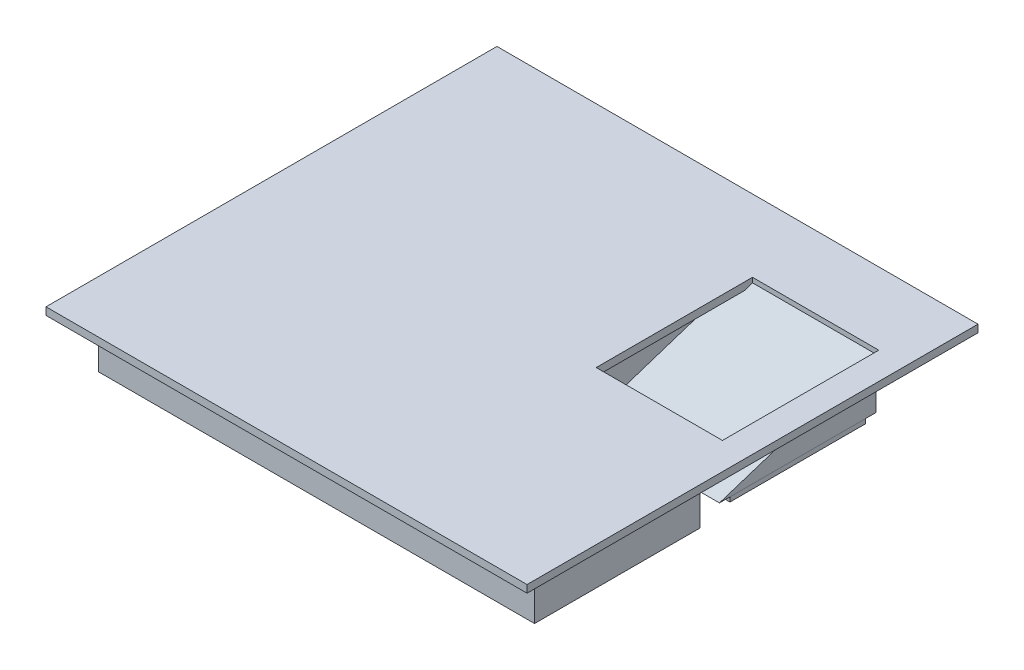
ISO-10303-21;
HEADER;
FILE_DESCRIPTION(('STEP AP214'),'2;1');
FILE_NAME('part.step','',(''),(''),'','','');
FILE_SCHEMA(('AUTOMOTIVE_DESIGN { 1 0 10303 214 1 1 1 1 }'));
ENDSEC;
DATA;
#1=APPLICATION_CONTEXT('core data for automotive mechanical design processes');
#2=APPLICATION_PROTOCOL_DEFINITION('international standard','automotive_design',2000,#1);
#3=PRODUCT_CONTEXT('',#1,'mechanical');
#4=PRODUCT('Part','Part','',(#3));
#5=PRODUCT_RELATED_PRODUCT_CATEGORY('part','',(#4));
#6=PRODUCT_DEFINITION_FORMATION('','',#4);
#7=PRODUCT_DEFINITION_CONTEXT('part definition',#1,'design');
#8=PRODUCT_DEFINITION('design','',#6,#7);
#9=PRODUCT_DEFINITION_SHAPE('','',#8);
#10=(LENGTH_UNIT() NAMED_UNIT(*) SI_UNIT(.MILLI.,.METRE.));
#11=(NAMED_UNIT(*) PLANE_ANGLE_UNIT() SI_UNIT($,.RADIAN.));
#12=(NAMED_UNIT(*) SI_UNIT($,.STERADIAN.) SOLID_ANGLE_UNIT());
#13=UNCERTAINTY_MEASURE_WITH_UNIT(LENGTH_MEASURE(1.E-05),#10,'distance_accuracy_value','');
#14=(GEOMETRIC_REPRESENTATION_CONTEXT(3) GLOBAL_UNCERTAINTY_ASSIGNED_CONTEXT((#13)) GLOBAL_UNIT_ASSIGNED_CONTEXT((#10,
#11,#12)) REPRESENTATION_CONTEXT('',''));
#15=CARTESIAN_POINT('',(0.,0.,0.));
#16=DIRECTION('',(0.,0.,1.));
#17=DIRECTION('',(1.,0.,0.));
#18=AXIS2_PLACEMENT_3D('',#15,#16,#17);
#19=CARTESIAN_POINT('',(0.,5.,0.));
#20=DIRECTION('',(1.,0.,0.));
#21=DIRECTION('',(0.,0.,-1.));
#22=AXIS2_PLACEMENT_3D('',#19,#20,#21);
#23=PLANE('',#22);
#24=DIRECTION('',(0.,0.,1.));
#25=VECTOR('',#24,1.);
#26=CARTESIAN_POINT('',(0.,0.,0.));
#27=LINE('',#26,#25);
#28=CARTESIAN_POINT('',(0.,0.,-300.));
#29=VERTEX_POINT('',#28);
#30=CARTESIAN_POINT('',(0.,0.,0.));
#31=VERTEX_POINT('',#30);
#32=EDGE_CURVE('E254',#29,#31,#27,.T.);
#33=ORIENTED_EDGE('',*,*,#32,.T.);
#34=DIRECTION('',(0.,-1.,0.));
#35=VECTOR('',#34,1.);
#36=CARTESIAN_POINT('',(0.,5.,0.));
#37=LINE('',#36,#35);
#38=CARTESIAN_POINT('',(0.,5.,0.));
#39=VERTEX_POINT('',#38);
#40=EDGE_CURVE('E325',#39,#31,#37,.T.);
#41=ORIENTED_EDGE('',*,*,#40,.F.);
#42=DIRECTION('',(0.,0.,1.));
#43=VECTOR('',#42,1.);
#44=CARTESIAN_POINT('',(0.,5.,0.));
#45=LINE('',#44,#43);
#46=CARTESIAN_POINT('',(0.,5.,-300.));
#47=VERTEX_POINT('',#46);
#48=EDGE_CURVE('E337',#47,#39,#45,.T.);
#49=ORIENTED_EDGE('',*,*,#48,.F.);
#50=DIRECTION('',(0.,-1.,0.));
#51=VECTOR('',#50,1.);
#52=CARTESIAN_POINT('',(0.,5.,-300.));
#53=LINE('',#52,#51);
#54=EDGE_CURVE('E338',#47,#29,#53,.T.);
#55=ORIENTED_EDGE('',*,*,#54,.T.);
#56=EDGE_LOOP('',(#33,#41,#49,#55));
#57=FACE_BOUND('',#56,.T.);
#58=ADVANCED_FACE('F47',(#57),#23,.F.);
#59=CARTESIAN_POINT('',(0.,5.,0.));
#60=DIRECTION('',(0.,0.,-1.));
#61=DIRECTION('',(-1.,0.,0.));
#62=AXIS2_PLACEMENT_3D('',#59,#60,#61);
#63=PLANE('',#62);
#64=DIRECTION('',(1.,0.,0.));
#65=VECTOR('',#64,1.);
#66=CARTESIAN_POINT('',(0.,0.,0.));
#67=LINE('',#66,#65);
#68=CARTESIAN_POINT('',(320.,0.,0.));
#69=VERTEX_POINT('',#68);
#70=EDGE_CURVE('E329',#31,#69,#67,.T.);
#71=ORIENTED_EDGE('',*,*,#70,.T.);
#72=DIRECTION('',(0.,-1.,0.));
#73=VECTOR('',#72,1.);
#74=CARTESIAN_POINT('',(320.,5.,0.));
#75=LINE('',#74,#73);
#76=CARTESIAN_POINT('',(320.,5.,0.));
#77=VERTEX_POINT('',#76);
#78=EDGE_CURVE('E330',#77,#69,#75,.T.);
#79=ORIENTED_EDGE('',*,*,#78,.F.);
#80=DIRECTION('',(1.,0.,0.));
#81=VECTOR('',#80,1.);
#82=CARTESIAN_POINT('',(0.,5.,0.));
#83=LINE('',#82,#81);
#84=EDGE_CURVE('E350',#39,#77,#83,.T.);
#85=ORIENTED_EDGE('',*,*,#84,.F.);
#86=ORIENTED_EDGE('',*,*,#40,.T.);
#87=EDGE_LOOP('',(#71,#79,#85,#86));
#88=FACE_BOUND('',#87,.T.);
#89=ADVANCED_FACE('F450',(#88),#63,.F.);
#90=CARTESIAN_POINT('',(320.,5.,0.));
#91=DIRECTION('',(-1.,0.,0.));
#92=DIRECTION('',(0.,0.,1.));
#93=AXIS2_PLACEMENT_3D('',#90,#91,#92);
#94=PLANE('',#93);
#95=DIRECTION('',(0.,0.,-1.));
#96=VECTOR('',#95,1.);
#97=CARTESIAN_POINT('',(320.,0.,0.));
#98=LINE('',#97,#96);
#99=CARTESIAN_POINT('',(320.,0.,-300.));
#100=VERTEX_POINT('',#99);
#101=EDGE_CURVE('E328',#69,#100,#98,.T.);
#102=ORIENTED_EDGE('',*,*,#101,.T.);
#103=DIRECTION('',(0.,-1.,0.));
#104=VECTOR('',#103,1.);
#105=CARTESIAN_POINT('',(320.,5.,-300.));
#106=LINE('',#105,#104);
#107=CARTESIAN_POINT('',(320.,5.,-300.));
#108=VERTEX_POINT('',#107);
#109=EDGE_CURVE('E334',#108,#100,#106,.T.);
#110=ORIENTED_EDGE('',*,*,#109,.F.);
#111=DIRECTION('',(0.,0.,-1.));
#112=VECTOR('',#111,1.);
#113=CARTESIAN_POINT('',(320.,5.,0.));
#114=LINE('',#113,#112);
#115=EDGE_CURVE('E348',#77,#108,#114,.T.);
#116=ORIENTED_EDGE('',*,*,#115,.F.);
#117=ORIENTED_EDGE('',*,*,#78,.T.);
#118=EDGE_LOOP('',(#102,#110,#116,#117));
#119=FACE_BOUND('',#118,.T.);
#120=ADVANCED_FACE('F456',(#119),#94,.F.);
#121=CARTESIAN_POINT('',(0.,5.,-300.));
#122=DIRECTION('',(0.,0.,1.));
#123=DIRECTION('',(1.,0.,0.));
#124=AXIS2_PLACEMENT_3D('',#121,#122,#123);
#125=PLANE('',#124);
#126=DIRECTION('',(-1.,0.,0.));
#127=VECTOR('',#126,1.);
#128=CARTESIAN_POINT('',(0.,0.,-300.));
#129=LINE('',#128,#127);
#130=EDGE_CURVE('E333',#100,#29,#129,.T.);
#131=ORIENTED_EDGE('',*,*,#130,.T.);
#132=ORIENTED_EDGE('',*,*,#54,.F.);
#133=DIRECTION('',(-1.,0.,0.));
#134=VECTOR('',#133,1.);
#135=CARTESIAN_POINT('',(0.,5.,-300.));
#136=LINE('',#135,#134);
#137=EDGE_CURVE('E346',#108,#47,#136,.T.);
#138=ORIENTED_EDGE('',*,*,#137,.F.);
#139=ORIENTED_EDGE('',*,*,#109,.T.);
#140=EDGE_LOOP('',(#131,#132,#138,#139));
#141=FACE_BOUND('',#140,.T.);
#142=ADVANCED_FACE('F464',(#141),#125,.F.);
#143=CARTESIAN_POINT('',(0.,5.,0.));
#144=DIRECTION('',(0.,-1.,0.));
#145=DIRECTION('',(0.,0.,-1.));
#146=AXIS2_PLACEMENT_3D('',#143,#144,#145);
#147=PLANE('',#146);
#148=DIRECTION('',(1.,0.,0.));
#149=VECTOR('',#148,1.);
#150=CARTESIAN_POINT('',(218.,5.,-148.));
#151=LINE('',#150,#149);
#152=CARTESIAN_POINT('',(218.,5.,-148.));
#153=VERTEX_POINT('',#152);
#154=CARTESIAN_POINT('',(302.,5.,-148.));
#155=VERTEX_POINT('',#154);
#156=EDGE_CURVE('E197',#153,#155,#151,.T.);
#157=ORIENTED_EDGE('',*,*,#156,.F.);
#158=DIRECTION('',(0.,0.,1.));
#159=VECTOR('',#158,1.);
#160=CARTESIAN_POINT('',(218.,5.,-252.));
#161=LINE('',#160,#159);
#162=CARTESIAN_POINT('',(218.,5.,-252.));
#163=VERTEX_POINT('',#162);
#164=EDGE_CURVE('E215',#163,#153,#161,.T.);
#165=ORIENTED_EDGE('',*,*,#164,.F.);
#166=DIRECTION('',(-1.,0.,0.));
#167=VECTOR('',#166,1.);
#168=CARTESIAN_POINT('',(218.,5.,-252.));
#169=LINE('',#168,#167);
#170=CARTESIAN_POINT('',(302.,5.,-252.));
#171=VERTEX_POINT('',#170);
#172=EDGE_CURVE('E208',#171,#163,#169,.T.);
#173=ORIENTED_EDGE('',*,*,#172,.F.);
#174=DIRECTION('',(0.,0.,-1.));
#175=VECTOR('',#174,1.);
#176=CARTESIAN_POINT('',(302.,5.,-252.));
#177=LINE('',#176,#175);
#178=EDGE_CURVE('E189',#155,#171,#177,.T.);
#179=ORIENTED_EDGE('',*,*,#178,.F.);
#180=EDGE_LOOP('',(#157,#165,#173,#179));
#181=FACE_BOUND('',#180,.T.);
#182=ORIENTED_EDGE('',*,*,#48,.T.);
#183=ORIENTED_EDGE('',*,*,#84,.T.);
#184=ORIENTED_EDGE('',*,*,#115,.T.);
#185=ORIENTED_EDGE('',*,*,#137,.T.);
#186=EDGE_LOOP('',(#182,#183,#184,#185));
#187=FACE_BOUND('',#186,.T.);
#188=ADVANCED_FACE('F205',(#181,#187),#147,.F.);
#189=CARTESIAN_POINT('',(0.,0.,0.));
#190=DIRECTION('',(0.,-1.,0.));
#191=DIRECTION('',(0.,0.,-1.));
#192=AXIS2_PLACEMENT_3D('',#189,#190,#191);
#193=PLANE('',#192);
#194=DIRECTION('',(-1.,0.,0.));
#195=VECTOR('',#194,1.);
#196=CARTESIAN_POINT('',(0.,0.,-246.485873189608));
#197=LINE('',#196,#195);
#198=CARTESIAN_POINT('',(218.,0.,-246.485873189608));
#199=VERTEX_POINT('',#198);
#200=CARTESIAN_POINT('',(210.,0.,-246.485873189608));
#201=VERTEX_POINT('',#200);
#202=EDGE_CURVE('E251',#199,#201,#197,.T.);
#203=ORIENTED_EDGE('',*,*,#202,.F.);
#204=DIRECTION('',(0.,0.,-1.));
#205=VECTOR('',#204,1.);
#206=CARTESIAN_POINT('',(218.,0.,0.));
#207=LINE('',#206,#205);
#208=CARTESIAN_POINT('',(218.,0.,-148.));
#209=VERTEX_POINT('',#208);
#210=EDGE_CURVE('E250',#209,#199,#207,.T.);
#211=ORIENTED_EDGE('',*,*,#210,.F.);
#212=DIRECTION('',(-1.,0.,0.));
#213=VECTOR('',#212,1.);
#214=CARTESIAN_POINT('',(0.,0.,-148.));
#215=LINE('',#214,#213);
#216=CARTESIAN_POINT('',(302.,0.,-148.));
#217=VERTEX_POINT('',#216);
#218=EDGE_CURVE('E209',#217,#209,#215,.T.);
#219=ORIENTED_EDGE('',*,*,#218,.F.);
#220=DIRECTION('',(0.,0.,1.));
#221=VECTOR('',#220,1.);
#222=CARTESIAN_POINT('',(302.,0.,0.));
#223=LINE('',#222,#221);
#224=CARTESIAN_POINT('',(302.,0.,-252.));
#225=VERTEX_POINT('',#224);
#226=EDGE_CURVE('E192',#225,#217,#223,.T.);
#227=ORIENTED_EDGE('',*,*,#226,.F.);
#228=DIRECTION('',(1.,0.,0.));
#229=VECTOR('',#228,1.);
#230=CARTESIAN_POINT('',(1.66533453693774E-13,0.,-252.));
#231=LINE('',#230,#229);
#232=CARTESIAN_POINT('',(300.,0.,-252.));
#233=VERTEX_POINT('',#232);
#234=EDGE_CURVE('E218',#233,#225,#231,.T.);
#235=ORIENTED_EDGE('',*,*,#234,.F.);
#236=CARTESIAN_POINT('',(210.,0.,-252.));
#237=VERTEX_POINT('',#236);
#238=EDGE_CURVE('E262',#237,#233,#231,.T.);
#239=ORIENTED_EDGE('',*,*,#238,.F.);
#240=DIRECTION('',(0.,0.,1.));
#241=VECTOR('',#240,1.);
#242=CARTESIAN_POINT('',(210.,0.,0.));
#243=LINE('',#242,#241);
#244=EDGE_CURVE('E12',#237,#201,#243,.T.);
#245=ORIENTED_EDGE('',*,*,#244,.T.);
#246=EDGE_LOOP('',(#203,#211,#219,#227,#235,#239,#245));
#247=FACE_BOUND('',#246,.T.);
#248=DIRECTION('',(0.,0.,-1.));
#249=VECTOR('',#248,1.);
#250=CARTESIAN_POINT('',(15.,0.,0.));
#251=LINE('',#250,#249);
#252=CARTESIAN_POINT('',(15.,0.,-20.));
#253=VERTEX_POINT('',#252);
#254=CARTESIAN_POINT('',(15.,0.,-130.));
#255=VERTEX_POINT('',#254);
#256=EDGE_CURVE('E266',#253,#255,#251,.T.);
#257=ORIENTED_EDGE('',*,*,#256,.F.);
#258=DIRECTION('',(-1.,0.,0.));
#259=VECTOR('',#258,1.);
#260=CARTESIAN_POINT('',(0.,0.,-20.));
#261=LINE('',#260,#259);
#262=CARTESIAN_POINT('',(305.,0.,-20.));
#263=VERTEX_POINT('',#262);
#264=EDGE_CURVE('E281',#263,#253,#261,.T.);
#265=ORIENTED_EDGE('',*,*,#264,.F.);
#266=DIRECTION('',(0.,0.,1.));
#267=VECTOR('',#266,1.);
#268=CARTESIAN_POINT('',(305.,0.,0.));
#269=LINE('',#268,#267);
#270=CARTESIAN_POINT('',(305.,0.,-130.));
#271=VERTEX_POINT('',#270);
#272=EDGE_CURVE('E276',#271,#263,#269,.T.);
#273=ORIENTED_EDGE('',*,*,#272,.F.);
#274=DIRECTION('',(1.,0.,0.));
#275=VECTOR('',#274,1.);
#276=CARTESIAN_POINT('',(0.,0.,-130.));
#277=LINE('',#276,#275);
#278=EDGE_CURVE('E271',#255,#271,#277,.T.);
#279=ORIENTED_EDGE('',*,*,#278,.F.);
#280=EDGE_LOOP('',(#257,#265,#273,#279));
#281=FACE_BOUND('',#280,.T.);
#282=DIRECTION('',(0.,0.,-1.));
#283=VECTOR('',#282,1.);
#284=CARTESIAN_POINT('',(120.,0.,0.));
#285=LINE('',#284,#283);
#286=CARTESIAN_POINT('',(120.,0.,-155.));
#287=VERTEX_POINT('',#286);
#288=CARTESIAN_POINT('',(120.,0.,-245.));
#289=VERTEX_POINT('',#288);
#290=EDGE_CURVE('E285',#287,#289,#285,.T.);
#291=ORIENTED_EDGE('',*,*,#290,.F.);
#292=DIRECTION('',(-1.,0.,0.));
#293=VECTOR('',#292,1.);
#294=CARTESIAN_POINT('',(0.,0.,-155.));
#295=LINE('',#294,#293);
#296=CARTESIAN_POINT('',(200.,0.,-155.));
#297=VERTEX_POINT('',#296);
#298=EDGE_CURVE('E300',#297,#287,#295,.T.);
#299=ORIENTED_EDGE('',*,*,#298,.F.);
#300=DIRECTION('',(0.,0.,1.));
#301=VECTOR('',#300,1.);
#302=CARTESIAN_POINT('',(200.,0.,0.));
#303=LINE('',#302,#301);
#304=CARTESIAN_POINT('',(200.,0.,-245.));
#305=VERTEX_POINT('',#304);
#306=EDGE_CURVE('E295',#305,#297,#303,.T.);
#307=ORIENTED_EDGE('',*,*,#306,.F.);
#308=DIRECTION('',(1.,0.,0.));
#309=VECTOR('',#308,1.);
#310=CARTESIAN_POINT('',(0.,0.,-245.));
#311=LINE('',#310,#309);
#312=EDGE_CURVE('E290',#289,#305,#311,.T.);
#313=ORIENTED_EDGE('',*,*,#312,.F.);
#314=EDGE_LOOP('',(#291,#299,#307,#313));
#315=FACE_BOUND('',#314,.T.);
#316=DIRECTION('',(0.,0.,-1.));
#317=VECTOR('',#316,1.);
#318=CARTESIAN_POINT('',(20.,0.,0.));
#319=LINE('',#318,#317);
#320=CARTESIAN_POINT('',(20.,0.,-155.));
#321=VERTEX_POINT('',#320);
#322=CARTESIAN_POINT('',(20.,0.,-245.));
#323=VERTEX_POINT('',#322);
#324=EDGE_CURVE('E305',#321,#323,#319,.T.);
#325=ORIENTED_EDGE('',*,*,#324,.F.);
#326=DIRECTION('',(-1.,0.,0.));
#327=VECTOR('',#326,1.);
#328=CARTESIAN_POINT('',(0.,0.,-155.));
#329=LINE('',#328,#327);
#330=CARTESIAN_POINT('',(100.,0.,-155.));
#331=VERTEX_POINT('',#330);
#332=EDGE_CURVE('E320',#331,#321,#329,.T.);
#333=ORIENTED_EDGE('',*,*,#332,.F.);
#334=DIRECTION('',(0.,0.,1.));
#335=VECTOR('',#334,1.);
#336=CARTESIAN_POINT('',(100.,0.,0.));
#337=LINE('',#336,#335);
#338=CARTESIAN_POINT('',(100.,0.,-245.));
#339=VERTEX_POINT('',#338);
#340=EDGE_CURVE('E315',#339,#331,#337,.T.);
#341=ORIENTED_EDGE('',*,*,#340,.F.);
#342=DIRECTION('',(1.,0.,0.));
#343=VECTOR('',#342,1.);
#344=CARTESIAN_POINT('',(0.,0.,-245.));
#345=LINE('',#344,#343);
#346=EDGE_CURVE('E310',#323,#339,#345,.T.);
#347=ORIENTED_EDGE('',*,*,#346,.F.);
#348=EDGE_LOOP('',(#325,#333,#341,#347));
#349=FACE_BOUND('',#348,.T.);
#350=ORIENTED_EDGE('',*,*,#32,.F.);
#351=ORIENTED_EDGE('',*,*,#130,.F.);
#352=ORIENTED_EDGE('',*,*,#101,.F.);
#353=ORIENTED_EDGE('',*,*,#70,.F.);
#354=EDGE_LOOP('',(#350,#351,#352,#353));
#355=FACE_BOUND('',#354,.T.);
#356=ADVANCED_FACE('F404',(#247,#281,#315,#349,#355),#193,.T.);
#357=CARTESIAN_POINT('',(20.,-35.,-245.));
#358=DIRECTION('',(-1.,0.,0.));
#359=DIRECTION('',(0.,0.,1.));
#360=AXIS2_PLACEMENT_3D('',#357,#358,#359);
#361=PLANE('',#360);
#362=DIRECTION('',(0.,1.,0.));
#363=VECTOR('',#362,1.);
#364=CARTESIAN_POINT('',(20.,-35.,-155.));
#365=LINE('',#364,#363);
#366=CARTESIAN_POINT('',(20.,-35.,-155.));
#367=VERTEX_POINT('',#366);
#368=EDGE_CURVE('E309',#367,#321,#365,.T.);
#369=ORIENTED_EDGE('',*,*,#368,.T.);
#370=ORIENTED_EDGE('',*,*,#324,.T.);
#371=DIRECTION('',(0.,1.,0.));
#372=VECTOR('',#371,1.);
#373=CARTESIAN_POINT('',(20.,-35.,-245.));
#374=LINE('',#373,#372);
#375=CARTESIAN_POINT('',(20.,-35.,-245.));
#376=VERTEX_POINT('',#375);
#377=EDGE_CURVE('E314',#376,#323,#374,.T.);
#378=ORIENTED_EDGE('',*,*,#377,.F.);
#379=DIRECTION('',(0.,0.,1.));
#380=VECTOR('',#379,1.);
#381=CARTESIAN_POINT('',(20.,-35.,-245.));
#382=LINE('',#381,#380);
#383=EDGE_CURVE('E308',#376,#367,#382,.T.);
#384=ORIENTED_EDGE('',*,*,#383,.T.);
#385=EDGE_LOOP('',(#369,#370,#378,#384));
#386=FACE_BOUND('',#385,.T.);
#387=ADVANCED_FACE('F471',(#386),#361,.T.);
#388=CARTESIAN_POINT('',(20.,-35.,-245.));
#389=DIRECTION('',(0.,0.,-1.));
#390=DIRECTION('',(-1.,0.,0.));
#391=AXIS2_PLACEMENT_3D('',#388,#389,#390);
#392=PLANE('',#391);
#393=ORIENTED_EDGE('',*,*,#377,.T.);
#394=ORIENTED_EDGE('',*,*,#346,.T.);
#395=DIRECTION('',(0.,1.,0.));
#396=VECTOR('',#395,1.);
#397=CARTESIAN_POINT('',(100.,-35.,-245.));
#398=LINE('',#397,#396);
#399=CARTESIAN_POINT('',(100.,-35.,-245.));
#400=VERTEX_POINT('',#399);
#401=EDGE_CURVE('E319',#400,#339,#398,.T.);
#402=ORIENTED_EDGE('',*,*,#401,.F.);
#403=DIRECTION('',(-1.,0.,0.));
#404=VECTOR('',#403,1.);
#405=CARTESIAN_POINT('',(20.,-35.,-245.));
#406=LINE('',#405,#404);
#407=EDGE_CURVE('E313',#400,#376,#406,.T.);
#408=ORIENTED_EDGE('',*,*,#407,.T.);
#409=EDGE_LOOP('',(#393,#394,#402,#408));
#410=FACE_BOUND('',#409,.T.);
#411=ADVANCED_FACE('F476',(#410),#392,.T.);
#412=CARTESIAN_POINT('',(100.,-35.,-245.));
#413=DIRECTION('',(1.,0.,0.));
#414=DIRECTION('',(0.,0.,-1.));
#415=AXIS2_PLACEMENT_3D('',#412,#413,#414);
#416=PLANE('',#415);
#417=ORIENTED_EDGE('',*,*,#401,.T.);
#418=ORIENTED_EDGE('',*,*,#340,.T.);
#419=DIRECTION('',(0.,1.,0.));
#420=VECTOR('',#419,1.);
#421=CARTESIAN_POINT('',(100.,-35.,-155.));
#422=LINE('',#421,#420);
#423=CARTESIAN_POINT('',(100.,-35.,-155.));
#424=VERTEX_POINT('',#423);
#425=EDGE_CURVE('E324',#424,#331,#422,.T.);
#426=ORIENTED_EDGE('',*,*,#425,.F.);
#427=DIRECTION('',(0.,0.,-1.));
#428=VECTOR('',#427,1.);
#429=CARTESIAN_POINT('',(100.,-35.,-245.));
#430=LINE('',#429,#428);
#431=EDGE_CURVE('E318',#424,#400,#430,.T.);
#432=ORIENTED_EDGE('',*,*,#431,.T.);
#433=EDGE_LOOP('',(#417,#418,#426,#432));
#434=FACE_BOUND('',#433,.T.);
#435=ADVANCED_FACE('F482',(#434),#416,.T.);
#436=CARTESIAN_POINT('',(20.,-35.,-155.));
#437=DIRECTION('',(0.,0.,1.));
#438=DIRECTION('',(1.,0.,0.));
#439=AXIS2_PLACEMENT_3D('',#436,#437,#438);
#440=PLANE('',#439);
#441=ORIENTED_EDGE('',*,*,#425,.T.);
#442=ORIENTED_EDGE('',*,*,#332,.T.);
#443=ORIENTED_EDGE('',*,*,#368,.F.);
#444=DIRECTION('',(1.,0.,0.));
#445=VECTOR('',#444,1.);
#446=CARTESIAN_POINT('',(20.,-35.,-155.));
#447=LINE('',#446,#445);
#448=EDGE_CURVE('E323',#367,#424,#447,.T.);
#449=ORIENTED_EDGE('',*,*,#448,.T.);
#450=EDGE_LOOP('',(#441,#442,#443,#449));
#451=FACE_BOUND('',#450,.T.);
#452=ADVANCED_FACE('F478',(#451),#440,.T.);
#453=CARTESIAN_POINT('',(0.,-35.,0.));
#454=DIRECTION('',(0.,1.,0.));
#455=DIRECTION('',(0.,0.,1.));
#456=AXIS2_PLACEMENT_3D('',#453,#454,#455);
#457=PLANE('',#456);
#458=ORIENTED_EDGE('',*,*,#383,.F.);
#459=ORIENTED_EDGE('',*,*,#407,.F.);
#460=ORIENTED_EDGE('',*,*,#431,.F.);
#461=ORIENTED_EDGE('',*,*,#448,.F.);
#462=EDGE_LOOP('',(#458,#459,#460,#461));
#463=FACE_BOUND('',#462,.T.);
#464=ADVANCED_FACE('F481',(#463),#457,.F.);
#465=CARTESIAN_POINT('',(120.,-35.,-245.));
#466=DIRECTION('',(-1.,0.,0.));
#467=DIRECTION('',(0.,0.,1.));
#468=AXIS2_PLACEMENT_3D('',#465,#466,#467);
#469=PLANE('',#468);
#470=DIRECTION('',(0.,1.,0.));
#471=VECTOR('',#470,1.);
#472=CARTESIAN_POINT('',(120.,-35.,-155.));
#473=LINE('',#472,#471);
#474=CARTESIAN_POINT('',(120.,-35.,-155.));
#475=VERTEX_POINT('',#474);
#476=EDGE_CURVE('E289',#475,#287,#473,.T.);
#477=ORIENTED_EDGE('',*,*,#476,.T.);
#478=ORIENTED_EDGE('',*,*,#290,.T.);
#479=DIRECTION('',(0.,1.,0.));
#480=VECTOR('',#479,1.);
#481=CARTESIAN_POINT('',(120.,-35.,-245.));
#482=LINE('',#481,#480);
#483=CARTESIAN_POINT('',(120.,-35.,-245.));
#484=VERTEX_POINT('',#483);
#485=EDGE_CURVE('E294',#484,#289,#482,.T.);
#486=ORIENTED_EDGE('',*,*,#485,.F.);
#487=DIRECTION('',(0.,0.,1.));
#488=VECTOR('',#487,1.);
#489=CARTESIAN_POINT('',(120.,-35.,-245.));
#490=LINE('',#489,#488);
#491=EDGE_CURVE('E288',#484,#475,#490,.T.);
#492=ORIENTED_EDGE('',*,*,#491,.T.);
#493=EDGE_LOOP('',(#477,#478,#486,#492));
#494=FACE_BOUND('',#493,.T.);
#495=ADVANCED_FACE('F492',(#494),#469,.T.);
#496=CARTESIAN_POINT('',(120.,-35.,-245.));
#497=DIRECTION('',(0.,0.,-1.));
#498=DIRECTION('',(-1.,0.,0.));
#499=AXIS2_PLACEMENT_3D('',#496,#497,#498);
#500=PLANE('',#499);
#501=ORIENTED_EDGE('',*,*,#485,.T.);
#502=ORIENTED_EDGE('',*,*,#312,.T.);
#503=DIRECTION('',(0.,1.,0.));
#504=VECTOR('',#503,1.);
#505=CARTESIAN_POINT('',(200.,-35.,-245.));
#506=LINE('',#505,#504);
#507=CARTESIAN_POINT('',(200.,-35.,-245.));
#508=VERTEX_POINT('',#507);
#509=EDGE_CURVE('E299',#508,#305,#506,.T.);
#510=ORIENTED_EDGE('',*,*,#509,.F.);
#511=DIRECTION('',(-1.,0.,0.));
#512=VECTOR('',#511,1.);
#513=CARTESIAN_POINT('',(120.,-35.,-245.));
#514=LINE('',#513,#512);
#515=EDGE_CURVE('E293',#508,#484,#514,.T.);
#516=ORIENTED_EDGE('',*,*,#515,.T.);
#517=EDGE_LOOP('',(#501,#502,#510,#516));
#518=FACE_BOUND('',#517,.T.);
#519=ADVANCED_FACE('F496',(#518),#500,.T.);
#520=CARTESIAN_POINT('',(200.,-35.,-245.));
#521=DIRECTION('',(1.,0.,0.));
#522=DIRECTION('',(0.,0.,-1.));
#523=AXIS2_PLACEMENT_3D('',#520,#521,#522);
#524=PLANE('',#523);
#525=ORIENTED_EDGE('',*,*,#509,.T.);
#526=ORIENTED_EDGE('',*,*,#306,.T.);
#527=DIRECTION('',(0.,1.,0.));
#528=VECTOR('',#527,1.);
#529=CARTESIAN_POINT('',(200.,-35.,-155.));
#530=LINE('',#529,#528);
#531=CARTESIAN_POINT('',(200.,-35.,-155.));
#532=VERTEX_POINT('',#531);
#533=EDGE_CURVE('E304',#532,#297,#530,.T.);
#534=ORIENTED_EDGE('',*,*,#533,.F.);
#535=DIRECTION('',(0.,0.,-1.));
#536=VECTOR('',#535,1.);
#537=CARTESIAN_POINT('',(200.,-35.,-245.));
#538=LINE('',#537,#536);
#539=EDGE_CURVE('E298',#532,#508,#538,.T.);
#540=ORIENTED_EDGE('',*,*,#539,.T.);
#541=EDGE_LOOP('',(#525,#526,#534,#540));
#542=FACE_BOUND('',#541,.T.);
#543=ADVANCED_FACE('F502',(#542),#524,.T.);
#544=CARTESIAN_POINT('',(120.,-35.,-155.));
#545=DIRECTION('',(0.,0.,1.));
#546=DIRECTION('',(1.,0.,0.));
#547=AXIS2_PLACEMENT_3D('',#544,#545,#546);
#548=PLANE('',#547);
#549=ORIENTED_EDGE('',*,*,#533,.T.);
#550=ORIENTED_EDGE('',*,*,#298,.T.);
#551=ORIENTED_EDGE('',*,*,#476,.F.);
#552=DIRECTION('',(1.,0.,0.));
#553=VECTOR('',#552,1.);
#554=CARTESIAN_POINT('',(120.,-35.,-155.));
#555=LINE('',#554,#553);
#556=EDGE_CURVE('E303',#475,#532,#555,.T.);
#557=ORIENTED_EDGE('',*,*,#556,.T.);
#558=EDGE_LOOP('',(#549,#550,#551,#557));
#559=FACE_BOUND('',#558,.T.);
#560=ADVANCED_FACE('F498',(#559),#548,.T.);
#561=CARTESIAN_POINT('',(0.,-35.,0.));
#562=DIRECTION('',(0.,1.,0.));
#563=DIRECTION('',(0.,0.,1.));
#564=AXIS2_PLACEMENT_3D('',#561,#562,#563);
#565=PLANE('',#564);
#566=ORIENTED_EDGE('',*,*,#491,.F.);
#567=ORIENTED_EDGE('',*,*,#515,.F.);
#568=ORIENTED_EDGE('',*,*,#539,.F.);
#569=ORIENTED_EDGE('',*,*,#556,.F.);
#570=EDGE_LOOP('',(#566,#567,#568,#569));
#571=FACE_BOUND('',#570,.T.);
#572=ADVANCED_FACE('F501',(#571),#565,.F.);
#573=CARTESIAN_POINT('',(15.,-35.,-130.));
#574=DIRECTION('',(-1.,0.,0.));
#575=DIRECTION('',(0.,0.,1.));
#576=AXIS2_PLACEMENT_3D('',#573,#574,#575);
#577=PLANE('',#576);
#578=DIRECTION('',(0.,1.,0.));
#579=VECTOR('',#578,1.);
#580=CARTESIAN_POINT('',(15.,-35.,-20.));
#581=LINE('',#580,#579);
#582=CARTESIAN_POINT('',(15.,-35.,-20.));
#583=VERTEX_POINT('',#582);
#584=EDGE_CURVE('E270',#583,#253,#581,.T.);
#585=ORIENTED_EDGE('',*,*,#584,.T.);
#586=ORIENTED_EDGE('',*,*,#256,.T.);
#587=DIRECTION('',(0.,1.,0.));
#588=VECTOR('',#587,1.);
#589=CARTESIAN_POINT('',(15.,-35.,-130.));
#590=LINE('',#589,#588);
#591=CARTESIAN_POINT('',(15.,-35.,-130.));
#592=VERTEX_POINT('',#591);
#593=EDGE_CURVE('E275',#592,#255,#590,.T.);
#594=ORIENTED_EDGE('',*,*,#593,.F.);
#595=DIRECTION('',(0.,0.,1.));
#596=VECTOR('',#595,1.);
#597=CARTESIAN_POINT('',(15.,-35.,-130.));
#598=LINE('',#597,#596);
#599=EDGE_CURVE('E269',#592,#583,#598,.T.);
#600=ORIENTED_EDGE('',*,*,#599,.T.);
#601=EDGE_LOOP('',(#585,#586,#594,#600));
#602=FACE_BOUND('',#601,.T.);
#603=ADVANCED_FACE('F512',(#602),#577,.T.);
#604=CARTESIAN_POINT('',(15.,-35.,-130.));
#605=DIRECTION('',(0.,0.,-1.));
#606=DIRECTION('',(-1.,0.,0.));
#607=AXIS2_PLACEMENT_3D('',#604,#605,#606);
#608=PLANE('',#607);
#609=ORIENTED_EDGE('',*,*,#593,.T.);
#610=ORIENTED_EDGE('',*,*,#278,.T.);
#611=DIRECTION('',(0.,1.,0.));
#612=VECTOR('',#611,1.);
#613=CARTESIAN_POINT('',(305.,-35.,-130.));
#614=LINE('',#613,#612);
#615=CARTESIAN_POINT('',(305.,-35.,-130.));
#616=VERTEX_POINT('',#615);
#617=EDGE_CURVE('E280',#616,#271,#614,.T.);
#618=ORIENTED_EDGE('',*,*,#617,.F.);
#619=DIRECTION('',(-1.,0.,0.));
#620=VECTOR('',#619,1.);
#621=CARTESIAN_POINT('',(15.,-35.,-130.));
#622=LINE('',#621,#620);
#623=EDGE_CURVE('E274',#616,#592,#622,.T.);
#624=ORIENTED_EDGE('',*,*,#623,.T.);
#625=EDGE_LOOP('',(#609,#610,#618,#624));
#626=FACE_BOUND('',#625,.T.);
#627=ADVANCED_FACE('F516',(#626),#608,.T.);
#628=CARTESIAN_POINT('',(305.,-35.,-130.));
#629=DIRECTION('',(1.,0.,0.));
#630=DIRECTION('',(0.,0.,-1.));
#631=AXIS2_PLACEMENT_3D('',#628,#629,#630);
#632=PLANE('',#631);
#633=ORIENTED_EDGE('',*,*,#617,.T.);
#634=ORIENTED_EDGE('',*,*,#272,.T.);
#635=DIRECTION('',(0.,1.,0.));
#636=VECTOR('',#635,1.);
#637=CARTESIAN_POINT('',(305.,-35.,-20.));
#638=LINE('',#637,#636);
#639=CARTESIAN_POINT('',(305.,-35.,-20.));
#640=VERTEX_POINT('',#639);
#641=EDGE_CURVE('E284',#640,#263,#638,.T.);
#642=ORIENTED_EDGE('',*,*,#641,.F.);
#643=DIRECTION('',(0.,0.,-1.));
#644=VECTOR('',#643,1.);
#645=CARTESIAN_POINT('',(305.,-35.,-130.));
#646=LINE('',#645,#644);
#647=EDGE_CURVE('E279',#640,#616,#646,.T.);
#648=ORIENTED_EDGE('',*,*,#647,.T.);
#649=EDGE_LOOP('',(#633,#634,#642,#648));
#650=FACE_BOUND('',#649,.T.);
#651=ADVANCED_FACE('F522',(#650),#632,.T.);
#652=CARTESIAN_POINT('',(15.,-35.,-20.));
#653=DIRECTION('',(0.,0.,1.));
#654=DIRECTION('',(1.,0.,0.));
#655=AXIS2_PLACEMENT_3D('',#652,#653,#654);
#656=PLANE('',#655);
#657=ORIENTED_EDGE('',*,*,#641,.T.);
#658=ORIENTED_EDGE('',*,*,#264,.T.);
#659=ORIENTED_EDGE('',*,*,#584,.F.);
#660=DIRECTION('',(1.,0.,0.));
#661=VECTOR('',#660,1.);
#662=CARTESIAN_POINT('',(15.,-35.,-20.));
#663=LINE('',#662,#661);
#664=EDGE_CURVE('E261',#583,#640,#663,.T.);
#665=ORIENTED_EDGE('',*,*,#664,.T.);
#666=EDGE_LOOP('',(#657,#658,#659,#665));
#667=FACE_BOUND('',#666,.T.);
#668=ADVANCED_FACE('F518',(#667),#656,.T.);
#669=CARTESIAN_POINT('',(0.,-35.,0.));
#670=DIRECTION('',(0.,1.,0.));
#671=DIRECTION('',(0.,0.,1.));
#672=AXIS2_PLACEMENT_3D('',#669,#670,#671);
#673=PLANE('',#672);
#674=ORIENTED_EDGE('',*,*,#599,.F.);
#675=ORIENTED_EDGE('',*,*,#623,.F.);
#676=ORIENTED_EDGE('',*,*,#647,.F.);
#677=ORIENTED_EDGE('',*,*,#664,.F.);
#678=EDGE_LOOP('',(#674,#675,#676,#677));
#679=FACE_BOUND('',#678,.T.);
#680=ADVANCED_FACE('F521',(#679),#673,.F.);
#681=CARTESIAN_POINT('',(218.,-32.,-252.));
#682=DIRECTION('',(-1.,0.,0.));
#683=DIRECTION('',(0.,0.,1.));
#684=AXIS2_PLACEMENT_3D('',#681,#682,#683);
#685=PLANE('',#684);
#686=ORIENTED_EDGE('',*,*,#210,.T.);
#687=DIRECTION('',(0.,0.309016994374949,-0.951056516295153));
#688=VECTOR('',#687,1.);
#689=CARTESIAN_POINT('',(218.,-1.43516688079131,-242.068883707497));
#690=LINE('',#689,#688);
#691=CARTESIAN_POINT('',(218.,1.79164840822237,-252.));
#692=VERTEX_POINT('',#691);
#693=EDGE_CURVE('E238',#199,#692,#690,.T.);
#694=ORIENTED_EDGE('',*,*,#693,.T.);
#695=DIRECTION('',(0.,1.,0.));
#696=VECTOR('',#695,1.);
#697=CARTESIAN_POINT('',(218.,-32.,-252.));
#698=LINE('',#697,#696);
#699=EDGE_CURVE('E219',#692,#163,#698,.T.);
#700=ORIENTED_EDGE('',*,*,#699,.T.);
#701=ORIENTED_EDGE('',*,*,#164,.T.);
#702=DIRECTION('',(0.,1.,0.));
#703=VECTOR('',#702,1.);
#704=CARTESIAN_POINT('',(218.,-32.,-148.));
#705=LINE('',#704,#703);
#706=EDGE_CURVE('E200',#209,#153,#705,.T.);
#707=ORIENTED_EDGE('',*,*,#706,.F.);
#708=EDGE_LOOP('',(#686,#694,#700,#701,#707));
#709=FACE_BOUND('',#708,.T.);
#710=ADVANCED_FACE('F248',(#709),#685,.F.);
#711=CARTESIAN_POINT('',(218.,-32.,-252.));
#712=DIRECTION('',(0.,0.,-1.));
#713=DIRECTION('',(-1.,0.,0.));
#714=AXIS2_PLACEMENT_3D('',#711,#712,#713);
#715=PLANE('',#714);
#716=ORIENTED_EDGE('',*,*,#699,.F.);
#717=DIRECTION('',(1.,0.,0.));
#718=VECTOR('',#717,1.);
#719=CARTESIAN_POINT('',(218.,1.79164840822238,-252.));
#720=LINE('',#719,#718);
#721=CARTESIAN_POINT('',(300.,1.79164840822237,-252.));
#722=VERTEX_POINT('',#721);
#723=EDGE_CURVE('E55',#692,#722,#720,.T.);
#724=ORIENTED_EDGE('',*,*,#723,.T.);
#725=DIRECTION('',(0.,-1.,0.));
#726=VECTOR('',#725,1.);
#727=CARTESIAN_POINT('',(300.,-32.,-252.));
#728=LINE('',#727,#726);
#729=EDGE_CURVE('E203',#722,#233,#728,.T.);
#730=ORIENTED_EDGE('',*,*,#729,.T.);
#731=ORIENTED_EDGE('',*,*,#234,.T.);
#732=DIRECTION('',(0.,1.,0.));
#733=VECTOR('',#732,1.);
#734=CARTESIAN_POINT('',(302.,-32.,-252.));
#735=LINE('',#734,#733);
#736=EDGE_CURVE('E264',#225,#171,#735,.T.);
#737=ORIENTED_EDGE('',*,*,#736,.T.);
#738=ORIENTED_EDGE('',*,*,#172,.T.);
#739=EDGE_LOOP('',(#716,#724,#730,#731,#737,#738));
#740=FACE_BOUND('',#739,.T.);
#741=ADVANCED_FACE('F49',(#740),#715,.F.);
#742=CARTESIAN_POINT('',(302.,-32.,-252.));
#743=DIRECTION('',(1.,0.,0.));
#744=DIRECTION('',(0.,0.,-1.));
#745=AXIS2_PLACEMENT_3D('',#742,#743,#744);
#746=PLANE('',#745);
#747=ORIENTED_EDGE('',*,*,#226,.T.);
#748=DIRECTION('',(0.,1.,0.));
#749=VECTOR('',#748,1.);
#750=CARTESIAN_POINT('',(302.,-32.,-148.));
#751=LINE('',#750,#749);
#752=EDGE_CURVE('E71',#217,#155,#751,.T.);
#753=ORIENTED_EDGE('',*,*,#752,.T.);
#754=ORIENTED_EDGE('',*,*,#178,.T.);
#755=ORIENTED_EDGE('',*,*,#736,.F.);
#756=EDGE_LOOP('',(#747,#753,#754,#755));
#757=FACE_BOUND('',#756,.T.);
#758=ADVANCED_FACE('F186',(#757),#746,.F.);
#759=CARTESIAN_POINT('',(218.,-32.,-148.));
#760=DIRECTION('',(0.,0.,1.));
#761=DIRECTION('',(1.,0.,0.));
#762=AXIS2_PLACEMENT_3D('',#759,#760,#761);
#763=PLANE('',#762);
#764=ORIENTED_EDGE('',*,*,#218,.T.);
#765=ORIENTED_EDGE('',*,*,#706,.T.);
#766=ORIENTED_EDGE('',*,*,#156,.T.);
#767=ORIENTED_EDGE('',*,*,#752,.F.);
#768=EDGE_LOOP('',(#764,#765,#766,#767));
#769=FACE_BOUND('',#768,.T.);
#770=ADVANCED_FACE('F198',(#769),#763,.F.);
#771=CARTESIAN_POINT('',(210.,-32.,-148.));
#772=DIRECTION('',(0.,-1.,0.));
#773=DIRECTION('',(0.,0.,-1.));
#774=AXIS2_PLACEMENT_3D('',#771,#772,#773);
#775=PLANE('',#774);
#776=DIRECTION('',(0.,0.,-1.));
#777=VECTOR('',#776,1.);
#778=CARTESIAN_POINT('',(300.,-32.,-148.));
#779=LINE('',#778,#777);
#780=CARTESIAN_POINT('',(300.,-32.,-148.));
#781=VERTEX_POINT('',#780);
#782=CARTESIAN_POINT('',(300.,-32.,-252.));
#783=VERTEX_POINT('',#782);
#784=EDGE_CURVE('E427',#781,#783,#779,.T.);
#785=ORIENTED_EDGE('',*,*,#784,.F.);
#786=DIRECTION('',(1.,0.,0.));
#787=VECTOR('',#786,1.);
#788=CARTESIAN_POINT('',(210.,-32.,-148.));
#789=LINE('',#788,#787);
#790=CARTESIAN_POINT('',(210.,-32.,-148.));
#791=VERTEX_POINT('',#790);
#792=EDGE_CURVE('E252',#791,#781,#789,.T.);
#793=ORIENTED_EDGE('',*,*,#792,.F.);
#794=DIRECTION('',(0.,0.,-1.));
#795=VECTOR('',#794,1.);
#796=CARTESIAN_POINT('',(210.,-32.,-148.));
#797=LINE('',#796,#795);
#798=CARTESIAN_POINT('',(210.,-32.,-252.));
#799=VERTEX_POINT('',#798);
#800=EDGE_CURVE('E420',#791,#799,#797,.T.);
#801=ORIENTED_EDGE('',*,*,#800,.T.);
#802=DIRECTION('',(1.,0.,0.));
#803=VECTOR('',#802,1.);
#804=CARTESIAN_POINT('',(210.,-32.,-252.));
#805=LINE('',#804,#803);
#806=EDGE_CURVE('E256',#799,#783,#805,.T.);
#807=ORIENTED_EDGE('',*,*,#806,.T.);
#808=EDGE_LOOP('',(#785,#793,#801,#807));
#809=FACE_BOUND('',#808,.T.);
#810=ADVANCED_FACE('F433',(#809),#775,.T.);
#811=CARTESIAN_POINT('',(210.,-32.,-148.));
#812=DIRECTION('',(0.,0.951056516295153,0.309016994374948));
#813=DIRECTION('',(0.,-0.309016994374949,0.951056516295153));
#814=AXIS2_PLACEMENT_3D('',#811,#812,#813);
#815=PLANE('',#814);
#816=ORIENTED_EDGE('',*,*,#693,.F.);
#817=ORIENTED_EDGE('',*,*,#202,.T.);
#818=DIRECTION('',(0.,-0.309016994374948,0.951056516295153));
#819=VECTOR('',#818,1.);
#820=CARTESIAN_POINT('',(210.,-32.,-148.));
#821=LINE('',#820,#819);
#822=EDGE_CURVE('E411',#201,#791,#821,.T.);
#823=ORIENTED_EDGE('',*,*,#822,.T.);
#824=ORIENTED_EDGE('',*,*,#792,.T.);
#825=DIRECTION('',(0.,-0.309016994374948,0.951056516295153));
#826=VECTOR('',#825,1.);
#827=CARTESIAN_POINT('',(300.,-32.,-148.));
#828=LINE('',#827,#826);
#829=EDGE_CURVE('E242',#722,#781,#828,.T.);
#830=ORIENTED_EDGE('',*,*,#829,.F.);
#831=ORIENTED_EDGE('',*,*,#723,.F.);
#832=EDGE_LOOP('',(#816,#817,#823,#824,#830,#831));
#833=FACE_BOUND('',#832,.T.);
#834=ADVANCED_FACE('F235',(#833),#815,.T.);
#835=CARTESIAN_POINT('',(210.,-32.,-252.));
#836=DIRECTION('',(0.,0.,-1.));
#837=DIRECTION('',(-1.,0.,0.));
#838=AXIS2_PLACEMENT_3D('',#835,#836,#837);
#839=PLANE('',#838);
#840=DIRECTION('',(0.,1.,0.));
#841=VECTOR('',#840,1.);
#842=CARTESIAN_POINT('',(210.,-32.,-252.));
#843=LINE('',#842,#841);
#844=EDGE_CURVE('E421',#799,#237,#843,.T.);
#845=ORIENTED_EDGE('',*,*,#844,.T.);
#846=ORIENTED_EDGE('',*,*,#238,.T.);
#847=DIRECTION('',(0.,1.,0.));
#848=VECTOR('',#847,1.);
#849=CARTESIAN_POINT('',(300.,-32.,-252.));
#850=LINE('',#849,#848);
#851=EDGE_CURVE('E62',#783,#233,#850,.T.);
#852=ORIENTED_EDGE('',*,*,#851,.F.);
#853=ORIENTED_EDGE('',*,*,#806,.F.);
#854=EDGE_LOOP('',(#845,#846,#852,#853));
#855=FACE_BOUND('',#854,.T.);
#856=ADVANCED_FACE('F440',(#855),#839,.T.);
#857=CARTESIAN_POINT('',(210.,0.,0.));
#858=DIRECTION('',(1.,0.,0.));
#859=DIRECTION('',(0.,0.,-1.));
#860=AXIS2_PLACEMENT_3D('',#857,#858,#859);
#861=PLANE('',#860);
#862=ORIENTED_EDGE('',*,*,#244,.F.);
#863=ORIENTED_EDGE('',*,*,#844,.F.);
#864=ORIENTED_EDGE('',*,*,#800,.F.);
#865=ORIENTED_EDGE('',*,*,#822,.F.);
#866=EDGE_LOOP('',(#862,#863,#864,#865));
#867=FACE_BOUND('',#866,.T.);
#868=ADVANCED_FACE('F416',(#867),#861,.F.);
#869=CARTESIAN_POINT('',(300.,0.,0.));
#870=DIRECTION('',(1.,0.,0.));
#871=DIRECTION('',(0.,0.,-1.));
#872=AXIS2_PLACEMENT_3D('',#869,#870,#871);
#873=PLANE('',#872);
#874=ORIENTED_EDGE('',*,*,#784,.T.);
#875=ORIENTED_EDGE('',*,*,#851,.T.);
#876=ORIENTED_EDGE('',*,*,#729,.F.);
#877=ORIENTED_EDGE('',*,*,#829,.T.);
#878=EDGE_LOOP('',(#874,#875,#876,#877));
#879=FACE_BOUND('',#878,.T.);
#880=ADVANCED_FACE('F441',(#879),#873,.T.);
#881=CLOSED_SHELL('',(#58,#89,#120,#142,#188,#356,#387,#411,#435,#452,#464,#495,#519,#543,#560,
#572,#603,#627,#651,#668,#680,#710,#741,#758,#770,#810,#834,#856,#868,#880));
#882=MANIFOLD_SOLID_BREP('B2',#881);
#883=CARTESIAN_POINT('',(0.,-35.,0.));
#884=DIRECTION('',(0.,1.,0.));
#885=DIRECTION('',(0.,0.,1.));
#886=AXIS2_PLACEMENT_3D('',#883,#884,#885);
#887=PLANE('',#886);
#888=DIRECTION('',(0.,0.,1.));
#889=VECTOR('',#888,1.);
#890=CARTESIAN_POINT('',(220.,-35.,-245.));
#891=LINE('',#890,#889);
#892=CARTESIAN_POINT('',(220.,-35.,-245.));
#893=VERTEX_POINT('',#892);
#894=CARTESIAN_POINT('',(220.,-35.,-155.));
#895=VERTEX_POINT('',#894);
#896=EDGE_CURVE('E813',#893,#895,#891,.T.);
#897=ORIENTED_EDGE('',*,*,#896,.F.);
#898=DIRECTION('',(-1.,0.,0.));
#899=VECTOR('',#898,1.);
#900=CARTESIAN_POINT('',(220.,-35.,-245.));
#901=LINE('',#900,#899);
#902=CARTESIAN_POINT('',(300.,-35.,-245.));
#903=VERTEX_POINT('',#902);
#904=EDGE_CURVE('E805',#903,#893,#901,.T.);
#905=ORIENTED_EDGE('',*,*,#904,.F.);
#906=DIRECTION('',(0.,0.,-1.));
#907=VECTOR('',#906,1.);
#908=CARTESIAN_POINT('',(300.,-35.,-245.));
#909=LINE('',#908,#907);
#910=CARTESIAN_POINT('',(300.,-35.,-155.));
#911=VERTEX_POINT('',#910);
#912=EDGE_CURVE('E810',#911,#903,#909,.T.);
#913=ORIENTED_EDGE('',*,*,#912,.F.);
#914=DIRECTION('',(1.,0.,0.));
#915=VECTOR('',#914,1.);
#916=CARTESIAN_POINT('',(220.,-35.,-155.));
#917=LINE('',#916,#915);
#918=EDGE_CURVE('E801',#895,#911,#917,.T.);
#919=ORIENTED_EDGE('',*,*,#918,.F.);
#920=EDGE_LOOP('',(#897,#905,#913,#919));
#921=FACE_BOUND('',#920,.T.);
#922=ADVANCED_FACE('F745',(#921),#887,.F.);
#923=CARTESIAN_POINT('',(220.,-35.,-155.));
#924=DIRECTION('',(0.,0.,1.));
#925=DIRECTION('',(1.,0.,0.));
#926=AXIS2_PLACEMENT_3D('',#923,#924,#925);
#927=PLANE('',#926);
#928=DIRECTION('',(0.,1.,0.));
#929=VECTOR('',#928,1.);
#930=CARTESIAN_POINT('',(300.,-35.,-155.));
#931=LINE('',#930,#929);
#932=CARTESIAN_POINT('',(300.,-32.,-155.));
#933=VERTEX_POINT('',#932);
#934=EDGE_CURVE('E793',#911,#933,#931,.T.);
#935=ORIENTED_EDGE('',*,*,#934,.T.);
#936=DIRECTION('',(-1.,0.,0.));
#937=VECTOR('',#936,1.);
#938=CARTESIAN_POINT('',(220.,-32.,-155.));
#939=LINE('',#938,#937);
#940=CARTESIAN_POINT('',(220.,-32.,-155.));
#941=VERTEX_POINT('',#940);
#942=EDGE_CURVE('E45',#933,#941,#939,.T.);
#943=ORIENTED_EDGE('',*,*,#942,.T.);
#944=DIRECTION('',(0.,1.,0.));
#945=VECTOR('',#944,1.);
#946=CARTESIAN_POINT('',(220.,-35.,-155.));
#947=LINE('',#946,#945);
#948=EDGE_CURVE('E802',#895,#941,#947,.T.);
#949=ORIENTED_EDGE('',*,*,#948,.F.);
#950=ORIENTED_EDGE('',*,*,#918,.T.);
#951=EDGE_LOOP('',(#935,#943,#949,#950));
#952=FACE_BOUND('',#951,.T.);
#953=ADVANCED_FACE('F799',(#952),#927,.T.);
#954=CARTESIAN_POINT('',(300.,-35.,-245.));
#955=DIRECTION('',(1.,0.,0.));
#956=DIRECTION('',(0.,0.,-1.));
#957=AXIS2_PLACEMENT_3D('',#954,#955,#956);
#958=PLANE('',#957);
#959=DIRECTION('',(0.,1.,0.));
#960=VECTOR('',#959,1.);
#961=CARTESIAN_POINT('',(300.,-35.,-245.));
#962=LINE('',#961,#960);
#963=CARTESIAN_POINT('',(300.,-32.,-245.));
#964=VERTEX_POINT('',#963);
#965=EDGE_CURVE('E795',#903,#964,#962,.T.);
#966=ORIENTED_EDGE('',*,*,#965,.T.);
#967=DIRECTION('',(0.,0.,1.));
#968=VECTOR('',#967,1.);
#969=CARTESIAN_POINT('',(300.,-32.,-245.));
#970=LINE('',#969,#968);
#971=EDGE_CURVE('E784',#964,#933,#970,.T.);
#972=ORIENTED_EDGE('',*,*,#971,.T.);
#973=ORIENTED_EDGE('',*,*,#934,.F.);
#974=ORIENTED_EDGE('',*,*,#912,.T.);
#975=EDGE_LOOP('',(#966,#972,#973,#974));
#976=FACE_BOUND('',#975,.T.);
#977=ADVANCED_FACE('F791',(#976),#958,.T.);
#978=CARTESIAN_POINT('',(220.,-35.,-245.));
#979=DIRECTION('',(0.,0.,-1.));
#980=DIRECTION('',(-1.,0.,0.));
#981=AXIS2_PLACEMENT_3D('',#978,#979,#980);
#982=PLANE('',#981);
#983=DIRECTION('',(0.,1.,0.));
#984=VECTOR('',#983,1.);
#985=CARTESIAN_POINT('',(220.,-35.,-245.));
#986=LINE('',#985,#984);
#987=CARTESIAN_POINT('',(220.,-32.,-245.));
#988=VERTEX_POINT('',#987);
#989=EDGE_CURVE('E753',#893,#988,#986,.T.);
#990=ORIENTED_EDGE('',*,*,#989,.T.);
#991=DIRECTION('',(1.,0.,0.));
#992=VECTOR('',#991,1.);
#993=CARTESIAN_POINT('',(220.,-32.,-245.));
#994=LINE('',#993,#992);
#995=EDGE_CURVE('E796',#988,#964,#994,.T.);
#996=ORIENTED_EDGE('',*,*,#995,.T.);
#997=ORIENTED_EDGE('',*,*,#965,.F.);
#998=ORIENTED_EDGE('',*,*,#904,.T.);
#999=EDGE_LOOP('',(#990,#996,#997,#998));
#1000=FACE_BOUND('',#999,.T.);
#1001=ADVANCED_FACE('F817',(#1000),#982,.T.);
#1002=CARTESIAN_POINT('',(220.,-35.,-245.));
#1003=DIRECTION('',(-1.,0.,0.));
#1004=DIRECTION('',(0.,0.,1.));
#1005=AXIS2_PLACEMENT_3D('',#1002,#1003,#1004);
#1006=PLANE('',#1005);
#1007=ORIENTED_EDGE('',*,*,#948,.T.);
#1008=DIRECTION('',(0.,0.,-1.));
#1009=VECTOR('',#1008,1.);
#1010=CARTESIAN_POINT('',(220.,-32.,-245.));
#1011=LINE('',#1010,#1009);
#1012=EDGE_CURVE('E760',#941,#988,#1011,.T.);
#1013=ORIENTED_EDGE('',*,*,#1012,.T.);
#1014=ORIENTED_EDGE('',*,*,#989,.F.);
#1015=ORIENTED_EDGE('',*,*,#896,.T.);
#1016=EDGE_LOOP('',(#1007,#1013,#1014,#1015));
#1017=FACE_BOUND('',#1016,.T.);
#1018=ADVANCED_FACE('F747',(#1017),#1006,.T.);
#1019=CARTESIAN_POINT('',(0.,-32.,0.));
#1020=DIRECTION('',(0.,1.,0.));
#1021=DIRECTION('',(0.,0.,1.));
#1022=AXIS2_PLACEMENT_3D('',#1019,#1020,#1021);
#1023=PLANE('',#1022);
#1024=ORIENTED_EDGE('',*,*,#942,.F.);
#1025=ORIENTED_EDGE('',*,*,#971,.F.);
#1026=ORIENTED_EDGE('',*,*,#995,.F.);
#1027=ORIENTED_EDGE('',*,*,#1012,.F.);
#1028=EDGE_LOOP('',(#1024,#1025,#1026,#1027));
#1029=FACE_BOUND('',#1028,.T.);
#1030=ADVANCED_FACE('F783',(#1029),#1023,.T.);
#1031=CLOSED_SHELL('',(#922,#953,#977,#1001,#1018,#1030));
#1032=MANIFOLD_SOLID_BREP('B6',#1031);
#1033=ADVANCED_BREP_SHAPE_REPRESENTATION('',(#18,#882,#1032),#14);
#1034=SHAPE_DEFINITION_REPRESENTATION(#9,#1033);
ENDSEC;
END-ISO-10303-21;
